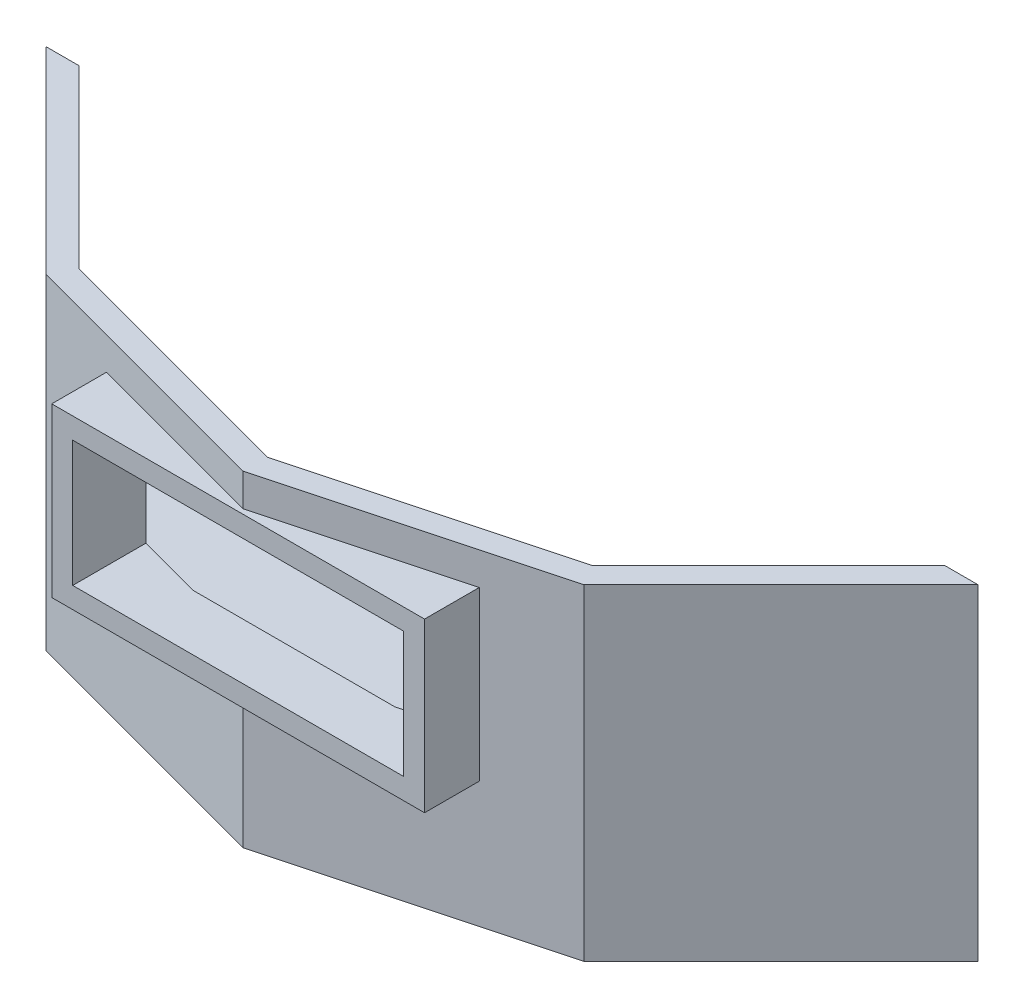
ISO-10303-21;
HEADER;
FILE_DESCRIPTION(('STEP AP214'),'2;1');
FILE_NAME('part.step','',(''),(''),'','','');
FILE_SCHEMA(('AUTOMOTIVE_DESIGN { 1 0 10303 214 1 1 1 1 }'));
ENDSEC;
DATA;
#1=APPLICATION_CONTEXT('core data for automotive mechanical design processes');
#2=APPLICATION_PROTOCOL_DEFINITION('international standard','automotive_design',2000,#1);
#3=PRODUCT_CONTEXT('',#1,'mechanical');
#4=PRODUCT('Part','Part','',(#3));
#5=PRODUCT_RELATED_PRODUCT_CATEGORY('part','',(#4));
#6=PRODUCT_DEFINITION_FORMATION('','',#4);
#7=PRODUCT_DEFINITION_CONTEXT('part definition',#1,'design');
#8=PRODUCT_DEFINITION('design','',#6,#7);
#9=PRODUCT_DEFINITION_SHAPE('','',#8);
#10=(LENGTH_UNIT() NAMED_UNIT(*) SI_UNIT(.MILLI.,.METRE.));
#11=(NAMED_UNIT(*) PLANE_ANGLE_UNIT() SI_UNIT($,.RADIAN.));
#12=(NAMED_UNIT(*) SI_UNIT($,.STERADIAN.) SOLID_ANGLE_UNIT());
#13=UNCERTAINTY_MEASURE_WITH_UNIT(LENGTH_MEASURE(1.E-05),#10,'distance_accuracy_value','');
#14=(GEOMETRIC_REPRESENTATION_CONTEXT(3) GLOBAL_UNCERTAINTY_ASSIGNED_CONTEXT((#13)) GLOBAL_UNIT_ASSIGNED_CONTEXT((#10,
#11,#12)) REPRESENTATION_CONTEXT('',''));
#15=CARTESIAN_POINT('',(0.,0.,0.));
#16=DIRECTION('',(0.,0.,1.));
#17=DIRECTION('',(1.,0.,0.));
#18=AXIS2_PLACEMENT_3D('',#15,#16,#17);
#19=CARTESIAN_POINT('',(0.,0.,104.5));
#20=DIRECTION('',(0.,0.,1.));
#21=DIRECTION('',(1.,0.,0.));
#22=AXIS2_PLACEMENT_3D('',#19,#20,#21);
#23=PLANE('',#22);
#24=DIRECTION('',(0.,-1.,0.));
#25=VECTOR('',#24,1.);
#26=CARTESIAN_POINT('',(21.6222817591213,5.,104.5));
#27=LINE('',#26,#25);
#28=CARTESIAN_POINT('',(21.6222817591213,63.,104.5));
#29=VERTEX_POINT('',#28);
#30=CARTESIAN_POINT('',(21.6222817591213,58.5,104.5));
#31=VERTEX_POINT('',#30);
#32=EDGE_CURVE('E277',#29,#31,#27,.T.);
#33=ORIENTED_EDGE('',*,*,#32,.T.);
#34=DIRECTION('',(-1.,0.,0.));
#35=VECTOR('',#34,1.);
#36=CARTESIAN_POINT('',(0.,58.5,104.5));
#37=LINE('',#36,#35);
#38=CARTESIAN_POINT('',(-21.6222817591212,58.5,104.5));
#39=VERTEX_POINT('',#38);
#40=EDGE_CURVE('E237',#31,#39,#37,.T.);
#41=ORIENTED_EDGE('',*,*,#40,.T.);
#42=DIRECTION('',(0.,1.,0.));
#43=VECTOR('',#42,1.);
#44=CARTESIAN_POINT('',(-21.6222817591212,5.,104.5));
#45=LINE('',#44,#43);
#46=CARTESIAN_POINT('',(-21.6222817591212,63.,104.5));
#47=VERTEX_POINT('',#46);
#48=EDGE_CURVE('E375',#39,#47,#45,.T.);
#49=ORIENTED_EDGE('',*,*,#48,.T.);
#50=DIRECTION('',(-1.,0.,0.));
#51=VECTOR('',#50,1.);
#52=CARTESIAN_POINT('',(-40.,63.,104.5));
#53=LINE('',#52,#51);
#54=EDGE_CURVE('E254',#29,#47,#53,.T.);
#55=ORIENTED_EDGE('',*,*,#54,.F.);
#56=EDGE_LOOP('',(#33,#41,#49,#55));
#57=FACE_BOUND('',#56,.T.);
#58=ADVANCED_FACE('F39',(#57),#23,.F.);
#59=CARTESIAN_POINT('',(-57.7350269189626,70.,100.));
#60=DIRECTION('',(0.258819045102521,0.,-0.965925826289068));
#61=DIRECTION('',(-0.965925826289068,0.,-0.258819045102521));
#62=AXIS2_PLACEMENT_3D('',#59,#60,#61);
#63=PLANE('',#62);
#64=DIRECTION('',(0.965925826289068,0.,0.258819045102521));
#65=VECTOR('',#64,1.);
#66=CARTESIAN_POINT('',(-57.7350269189626,27.,100.));
#67=LINE('',#66,#65);
#68=CARTESIAN_POINT('',(-40.,27.,104.75208614068));
#69=VERTEX_POINT('',#68);
#70=CARTESIAN_POINT('',(0.,27.,115.470053837925));
#71=VERTEX_POINT('',#70);
#72=EDGE_CURVE('E295',#69,#71,#67,.T.);
#73=ORIENTED_EDGE('',*,*,#72,.F.);
#74=DIRECTION('',(0.,-1.,0.));
#75=VECTOR('',#74,1.);
#76=CARTESIAN_POINT('',(-40.,70.,104.75208614068));
#77=LINE('',#76,#75);
#78=CARTESIAN_POINT('',(-40.,63.,104.75208614068));
#79=VERTEX_POINT('',#78);
#80=EDGE_CURVE('E11',#79,#69,#77,.T.);
#81=ORIENTED_EDGE('',*,*,#80,.F.);
#82=DIRECTION('',(-0.965925826289068,0.,-0.258819045102521));
#83=VECTOR('',#82,1.);
#84=CARTESIAN_POINT('',(-57.7350269189626,63.,100.));
#85=LINE('',#84,#83);
#86=CARTESIAN_POINT('',(0.,63.,115.470053837925));
#87=VERTEX_POINT('',#86);
#88=EDGE_CURVE('E286',#87,#79,#85,.T.);
#89=ORIENTED_EDGE('',*,*,#88,.F.);
#90=DIRECTION('',(0.,-1.,0.));
#91=VECTOR('',#90,1.);
#92=CARTESIAN_POINT('',(0.,70.,115.470053837925));
#93=LINE('',#92,#91);
#94=CARTESIAN_POINT('',(0.,70.,115.470053837925));
#95=VERTEX_POINT('',#94);
#96=EDGE_CURVE('E363',#95,#87,#93,.T.);
#97=ORIENTED_EDGE('',*,*,#96,.F.);
#98=DIRECTION('',(0.965925826289068,0.,0.258819045102521));
#99=VECTOR('',#98,1.);
#100=CARTESIAN_POINT('',(-57.7350269189626,70.,100.));
#101=LINE('',#100,#99);
#102=CARTESIAN_POINT('',(-57.7350269189626,70.,100.));
#103=VERTEX_POINT('',#102);
#104=EDGE_CURVE('E339',#103,#95,#101,.T.);
#105=ORIENTED_EDGE('',*,*,#104,.F.);
#106=DIRECTION('',(0.,-1.,0.));
#107=VECTOR('',#106,1.);
#108=CARTESIAN_POINT('',(-57.7350269189626,70.,100.));
#109=LINE('',#108,#107);
#110=CARTESIAN_POINT('',(-57.7350269189626,0.,100.));
#111=VERTEX_POINT('',#110);
#112=EDGE_CURVE('E365',#103,#111,#109,.T.);
#113=ORIENTED_EDGE('',*,*,#112,.T.);
#114=DIRECTION('',(0.965925826289068,0.,0.258819045102521));
#115=VECTOR('',#114,1.);
#116=CARTESIAN_POINT('',(-57.7350269189626,0.,100.));
#117=LINE('',#116,#115);
#118=CARTESIAN_POINT('',(0.,0.,115.470053837925));
#119=VERTEX_POINT('',#118);
#120=EDGE_CURVE('E350',#111,#119,#117,.T.);
#121=ORIENTED_EDGE('',*,*,#120,.T.);
#122=EDGE_CURVE('E362',#71,#119,#93,.T.);
#123=ORIENTED_EDGE('',*,*,#122,.F.);
#124=EDGE_LOOP('',(#73,#81,#89,#97,#105,#113,#121,#123));
#125=FACE_BOUND('',#124,.T.);
#126=ADVANCED_FACE('F402',(#125),#63,.F.);
#127=CARTESIAN_POINT('',(0.,70.,115.470053837925));
#128=DIRECTION('',(-0.258819045102521,0.,-0.965925826289068));
#129=DIRECTION('',(-0.965925826289068,0.,0.258819045102521));
#130=AXIS2_PLACEMENT_3D('',#127,#128,#129);
#131=PLANE('',#130);
#132=DIRECTION('',(0.965925826289068,0.,-0.258819045102521));
#133=VECTOR('',#132,1.);
#134=CARTESIAN_POINT('',(0.,27.,115.470053837925));
#135=LINE('',#134,#133);
#136=CARTESIAN_POINT('',(40.,27.,104.75208614068));
#137=VERTEX_POINT('',#136);
#138=EDGE_CURVE('E292',#71,#137,#135,.T.);
#139=ORIENTED_EDGE('',*,*,#138,.F.);
#140=ORIENTED_EDGE('',*,*,#122,.T.);
#141=DIRECTION('',(0.965925826289068,0.,-0.258819045102521));
#142=VECTOR('',#141,1.);
#143=CARTESIAN_POINT('',(0.,0.,115.470053837925));
#144=LINE('',#143,#142);
#145=CARTESIAN_POINT('',(57.7350269189626,0.,100.));
#146=VERTEX_POINT('',#145);
#147=EDGE_CURVE('E353',#119,#146,#144,.T.);
#148=ORIENTED_EDGE('',*,*,#147,.T.);
#149=DIRECTION('',(0.,-1.,0.));
#150=VECTOR('',#149,1.);
#151=CARTESIAN_POINT('',(57.7350269189626,70.,100.));
#152=LINE('',#151,#150);
#153=CARTESIAN_POINT('',(57.7350269189626,70.,100.));
#154=VERTEX_POINT('',#153);
#155=EDGE_CURVE('E359',#154,#146,#152,.T.);
#156=ORIENTED_EDGE('',*,*,#155,.F.);
#157=DIRECTION('',(0.965925826289068,0.,-0.258819045102521));
#158=VECTOR('',#157,1.);
#159=CARTESIAN_POINT('',(0.,70.,115.470053837925));
#160=LINE('',#159,#158);
#161=EDGE_CURVE('E341',#95,#154,#160,.T.);
#162=ORIENTED_EDGE('',*,*,#161,.F.);
#163=ORIENTED_EDGE('',*,*,#96,.T.);
#164=DIRECTION('',(-0.965925826289068,0.,0.258819045102521));
#165=VECTOR('',#164,1.);
#166=CARTESIAN_POINT('',(0.,63.,115.470053837925));
#167=LINE('',#166,#165);
#168=CARTESIAN_POINT('',(40.,63.,104.75208614068));
#169=VERTEX_POINT('',#168);
#170=EDGE_CURVE('E283',#169,#87,#167,.T.);
#171=ORIENTED_EDGE('',*,*,#170,.F.);
#172=DIRECTION('',(0.,1.,0.));
#173=VECTOR('',#172,1.);
#174=CARTESIAN_POINT('',(40.,70.,104.75208614068));
#175=LINE('',#174,#173);
#176=EDGE_CURVE('E47',#137,#169,#175,.T.);
#177=ORIENTED_EDGE('',*,*,#176,.F.);
#178=EDGE_LOOP('',(#139,#140,#148,#156,#162,#163,#171,#177));
#179=FACE_BOUND('',#178,.T.);
#180=ADVANCED_FACE('F400',(#179),#131,.F.);
#181=CARTESIAN_POINT('',(0.,5.,110.293672935875));
#182=DIRECTION('',(0.258819045102521,0.,0.965925826289068));
#183=DIRECTION('',(0.965925826289068,0.,-0.258819045102521));
#184=AXIS2_PLACEMENT_3D('',#181,#182,#183);
#185=PLANE('',#184);
#186=DIRECTION('',(0.,1.,0.));
#187=VECTOR('',#186,1.);
#188=CARTESIAN_POINT('',(35.5,5.00000000000001,100.78147660457));
#189=LINE('',#188,#187);
#190=CARTESIAN_POINT('',(35.5,31.5,100.78147660457));
#191=VERTEX_POINT('',#190);
#192=CARTESIAN_POINT('',(35.5,58.5,100.78147660457));
#193=VERTEX_POINT('',#192);
#194=EDGE_CURVE('E209',#191,#193,#189,.T.);
#195=ORIENTED_EDGE('',*,*,#194,.T.);
#196=DIRECTION('',(-0.965925826289068,0.,0.258819045102521));
#197=VECTOR('',#196,1.);
#198=CARTESIAN_POINT('',(0.,58.5,110.293672935875));
#199=LINE('',#198,#197);
#200=EDGE_CURVE('E243',#193,#31,#199,.T.);
#201=ORIENTED_EDGE('',*,*,#200,.T.);
#202=ORIENTED_EDGE('',*,*,#32,.F.);
#203=DIRECTION('',(0.965925826289068,0.,-0.258819045102521));
#204=VECTOR('',#203,1.);
#205=CARTESIAN_POINT('',(0.,63.,110.293672935875));
#206=LINE('',#205,#204);
#207=CARTESIAN_POINT('',(0.,63.,110.293672935875));
#208=VERTEX_POINT('',#207);
#209=EDGE_CURVE('E280',#208,#29,#206,.T.);
#210=ORIENTED_EDGE('',*,*,#209,.F.);
#211=DIRECTION('',(0.,1.,0.));
#212=VECTOR('',#211,1.);
#213=CARTESIAN_POINT('',(0.,5.,110.293672935875));
#214=LINE('',#213,#212);
#215=CARTESIAN_POINT('',(0.,70.,110.293672935875));
#216=VERTEX_POINT('',#215);
#217=EDGE_CURVE('E324',#208,#216,#214,.T.);
#218=ORIENTED_EDGE('',*,*,#217,.T.);
#219=DIRECTION('',(0.965925826289068,0.,-0.258819045102521));
#220=VECTOR('',#219,1.);
#221=CARTESIAN_POINT('',(0.,70.,110.293672935875));
#222=LINE('',#221,#220);
#223=CARTESIAN_POINT('',(55.1468364679374,70.,95.5171226391597));
#224=VERTEX_POINT('',#223);
#225=EDGE_CURVE('E314',#216,#224,#222,.T.);
#226=ORIENTED_EDGE('',*,*,#225,.T.);
#227=DIRECTION('',(0.,1.,0.));
#228=VECTOR('',#227,1.);
#229=CARTESIAN_POINT('',(55.1468364679374,5.,95.5171226391597));
#230=LINE('',#229,#228);
#231=CARTESIAN_POINT('',(55.1468364679374,5.,95.5171226391597));
#232=VERTEX_POINT('',#231);
#233=EDGE_CURVE('E318',#232,#224,#230,.T.);
#234=ORIENTED_EDGE('',*,*,#233,.F.);
#235=DIRECTION('',(0.965925826289068,0.,-0.258819045102521));
#236=VECTOR('',#235,1.);
#237=CARTESIAN_POINT('',(0.,5.,110.293672935875));
#238=LINE('',#237,#236);
#239=CARTESIAN_POINT('',(0.,5.,110.293672935875));
#240=VERTEX_POINT('',#239);
#241=EDGE_CURVE('E305',#240,#232,#238,.T.);
#242=ORIENTED_EDGE('',*,*,#241,.F.);
#243=CARTESIAN_POINT('',(0.,27.,110.293672935875));
#244=VERTEX_POINT('',#243);
#245=EDGE_CURVE('E321',#240,#244,#214,.T.);
#246=ORIENTED_EDGE('',*,*,#245,.T.);
#247=DIRECTION('',(-0.965925826289068,0.,0.258819045102521));
#248=VECTOR('',#247,1.);
#249=CARTESIAN_POINT('',(0.,27.,110.293672935875));
#250=LINE('',#249,#248);
#251=CARTESIAN_POINT('',(21.6222817591213,27.,104.5));
#252=VERTEX_POINT('',#251);
#253=EDGE_CURVE('E289',#252,#244,#250,.T.);
#254=ORIENTED_EDGE('',*,*,#253,.F.);
#255=CARTESIAN_POINT('',(21.6222817591213,31.5,104.5));
#256=VERTEX_POINT('',#255);
#257=EDGE_CURVE('E276',#256,#252,#27,.T.);
#258=ORIENTED_EDGE('',*,*,#257,.F.);
#259=DIRECTION('',(0.965925826289068,0.,-0.258819045102521));
#260=VECTOR('',#259,1.);
#261=CARTESIAN_POINT('',(0.,31.5,110.293672935875));
#262=LINE('',#261,#260);
#263=EDGE_CURVE('E54',#256,#191,#262,.T.);
#264=ORIENTED_EDGE('',*,*,#263,.T.);
#265=EDGE_LOOP('',(#195,#201,#202,#210,#218,#226,#234,#242,#246,#254,#258,#264));
#266=FACE_BOUND('',#265,.T.);
#267=ADVANCED_FACE('F465',(#266),#185,.F.);
#268=CARTESIAN_POINT('',(-55.1468364679374,5.,95.5171226391597));
#269=DIRECTION('',(-0.258819045102521,0.,0.965925826289068));
#270=DIRECTION('',(0.965925826289068,0.,0.258819045102521));
#271=AXIS2_PLACEMENT_3D('',#268,#269,#270);
#272=PLANE('',#271);
#273=ORIENTED_EDGE('',*,*,#48,.F.);
#274=DIRECTION('',(-0.965925826289068,0.,-0.258819045102521));
#275=VECTOR('',#274,1.);
#276=CARTESIAN_POINT('',(-55.1468364679374,58.5,95.5171226391597));
#277=LINE('',#276,#275);
#278=CARTESIAN_POINT('',(-35.5,58.5,100.78147660457));
#279=VERTEX_POINT('',#278);
#280=EDGE_CURVE('E240',#39,#279,#277,.T.);
#281=ORIENTED_EDGE('',*,*,#280,.T.);
#282=DIRECTION('',(0.,-1.,0.));
#283=VECTOR('',#282,1.);
#284=CARTESIAN_POINT('',(-35.5,5.00000000000001,100.78147660457));
#285=LINE('',#284,#283);
#286=CARTESIAN_POINT('',(-35.5,31.5,100.78147660457));
#287=VERTEX_POINT('',#286);
#288=EDGE_CURVE('E246',#279,#287,#285,.T.);
#289=ORIENTED_EDGE('',*,*,#288,.T.);
#290=DIRECTION('',(0.965925826289068,0.,0.258819045102521));
#291=VECTOR('',#290,1.);
#292=CARTESIAN_POINT('',(-55.1468364679374,31.5,95.5171226391597));
#293=LINE('',#292,#291);
#294=CARTESIAN_POINT('',(-21.6222817591212,31.5,104.5));
#295=VERTEX_POINT('',#294);
#296=EDGE_CURVE('E232',#287,#295,#293,.T.);
#297=ORIENTED_EDGE('',*,*,#296,.T.);
#298=CARTESIAN_POINT('',(-21.6222817591212,27.,104.5));
#299=VERTEX_POINT('',#298);
#300=EDGE_CURVE('E376',#299,#295,#45,.T.);
#301=ORIENTED_EDGE('',*,*,#300,.F.);
#302=DIRECTION('',(-0.965925826289068,0.,-0.258819045102521));
#303=VECTOR('',#302,1.);
#304=CARTESIAN_POINT('',(-55.1468364679374,27.,95.5171226391597));
#305=LINE('',#304,#303);
#306=EDGE_CURVE('E382',#244,#299,#305,.T.);
#307=ORIENTED_EDGE('',*,*,#306,.F.);
#308=ORIENTED_EDGE('',*,*,#245,.F.);
#309=DIRECTION('',(0.965925826289068,0.,0.258819045102521));
#310=VECTOR('',#309,1.);
#311=CARTESIAN_POINT('',(-55.1468364679374,5.,95.5171226391597));
#312=LINE('',#311,#310);
#313=CARTESIAN_POINT('',(-55.1468364679374,5.,95.5171226391597));
#314=VERTEX_POINT('',#313);
#315=EDGE_CURVE('E301',#314,#240,#312,.T.);
#316=ORIENTED_EDGE('',*,*,#315,.F.);
#317=DIRECTION('',(0.,1.,0.));
#318=VECTOR('',#317,1.);
#319=CARTESIAN_POINT('',(-55.1468364679374,5.,95.5171226391597));
#320=LINE('',#319,#318);
#321=CARTESIAN_POINT('',(-55.1468364679374,70.,95.5171226391597));
#322=VERTEX_POINT('',#321);
#323=EDGE_CURVE('E311',#314,#322,#320,.T.);
#324=ORIENTED_EDGE('',*,*,#323,.T.);
#325=DIRECTION('',(0.965925826289068,0.,0.258819045102521));
#326=VECTOR('',#325,1.);
#327=CARTESIAN_POINT('',(-55.1468364679374,70.,95.5171226391597));
#328=LINE('',#327,#326);
#329=EDGE_CURVE('E298',#322,#216,#328,.T.);
#330=ORIENTED_EDGE('',*,*,#329,.T.);
#331=ORIENTED_EDGE('',*,*,#217,.F.);
#332=DIRECTION('',(0.965925826289068,0.,0.258819045102521));
#333=VECTOR('',#332,1.);
#334=CARTESIAN_POINT('',(-55.1468364679374,63.,95.5171226391597));
#335=LINE('',#334,#333);
#336=EDGE_CURVE('E379',#47,#208,#335,.T.);
#337=ORIENTED_EDGE('',*,*,#336,.F.);
#338=EDGE_LOOP('',(#273,#281,#289,#297,#301,#307,#308,#316,#324,#330,#331,#337));
#339=FACE_BOUND('',#338,.T.);
#340=ADVANCED_FACE('F462',(#339),#272,.F.);
#341=CARTESIAN_POINT('',(-100.,70.,57.7350269189626));
#342=DIRECTION('',(0.,0.,1.));
#343=DIRECTION('',(1.,0.,0.));
#344=AXIS2_PLACEMENT_3D('',#341,#342,#343);
#345=PLANE('',#344);
#346=DIRECTION('',(-1.,0.,0.));
#347=VECTOR('',#346,1.);
#348=CARTESIAN_POINT('',(-100.,5.,57.7350269189626));
#349=LINE('',#348,#347);
#350=CARTESIAN_POINT('',(92.9289321881345,5.,57.7350269189626));
#351=VERTEX_POINT('',#350);
#352=CARTESIAN_POINT('',(-92.9289321881346,5.,57.7350269189626));
#353=VERTEX_POINT('',#352);
#354=EDGE_CURVE('E373',#351,#353,#349,.T.);
#355=ORIENTED_EDGE('',*,*,#354,.F.);
#356=DIRECTION('',(0.,1.,0.));
#357=VECTOR('',#356,1.);
#358=CARTESIAN_POINT('',(92.9289321881345,70.,57.7350269189626));
#359=LINE('',#358,#357);
#360=CARTESIAN_POINT('',(92.9289321881345,70.,57.7350269189626));
#361=VERTEX_POINT('',#360);
#362=EDGE_CURVE('E329',#351,#361,#359,.T.);
#363=ORIENTED_EDGE('',*,*,#362,.T.);
#364=DIRECTION('',(-1.,0.,0.));
#365=VECTOR('',#364,1.);
#366=CARTESIAN_POINT('',(-100.,70.,57.7350269189626));
#367=LINE('',#366,#365);
#368=CARTESIAN_POINT('',(100.,70.,57.7350269189626));
#369=VERTEX_POINT('',#368);
#370=EDGE_CURVE('E333',#369,#361,#367,.T.);
#371=ORIENTED_EDGE('',*,*,#370,.F.);
#372=DIRECTION('',(0.,-1.,0.));
#373=VECTOR('',#372,1.);
#374=CARTESIAN_POINT('',(100.,70.,57.7350269189626));
#375=LINE('',#374,#373);
#376=CARTESIAN_POINT('',(100.,0.,57.7350269189626));
#377=VERTEX_POINT('',#376);
#378=EDGE_CURVE('E345',#369,#377,#375,.T.);
#379=ORIENTED_EDGE('',*,*,#378,.T.);
#380=DIRECTION('',(-1.,0.,0.));
#381=VECTOR('',#380,1.);
#382=CARTESIAN_POINT('',(-100.,0.,57.7350269189626));
#383=LINE('',#382,#381);
#384=CARTESIAN_POINT('',(-100.,0.,57.7350269189626));
#385=VERTEX_POINT('',#384);
#386=EDGE_CURVE('E332',#377,#385,#383,.T.);
#387=ORIENTED_EDGE('',*,*,#386,.T.);
#388=DIRECTION('',(0.,-1.,0.));
#389=VECTOR('',#388,1.);
#390=CARTESIAN_POINT('',(-100.,70.,57.7350269189626));
#391=LINE('',#390,#389);
#392=CARTESIAN_POINT('',(-100.,70.,57.7350269189626));
#393=VERTEX_POINT('',#392);
#394=EDGE_CURVE('E368',#393,#385,#391,.T.);
#395=ORIENTED_EDGE('',*,*,#394,.F.);
#396=CARTESIAN_POINT('',(-92.9289321881346,70.,57.7350269189626));
#397=VERTEX_POINT('',#396);
#398=EDGE_CURVE('E337',#397,#393,#367,.T.);
#399=ORIENTED_EDGE('',*,*,#398,.F.);
#400=DIRECTION('',(0.,-1.,0.));
#401=VECTOR('',#400,1.);
#402=CARTESIAN_POINT('',(-92.9289321881346,70.,57.7350269189626));
#403=LINE('',#402,#401);
#404=EDGE_CURVE('E320',#397,#353,#403,.T.);
#405=ORIENTED_EDGE('',*,*,#404,.T.);
#406=EDGE_LOOP('',(#355,#363,#371,#379,#387,#395,#399,#405));
#407=FACE_BOUND('',#406,.T.);
#408=ADVANCED_FACE('F41',(#407),#345,.F.);
#409=CARTESIAN_POINT('',(-100.,70.,57.7350269189626));
#410=DIRECTION('',(0.707106781186548,0.,-0.707106781186547));
#411=DIRECTION('',(-0.707106781186547,0.,-0.707106781186548));
#412=AXIS2_PLACEMENT_3D('',#409,#410,#411);
#413=PLANE('',#412);
#414=DIRECTION('',(0.707106781186547,0.,0.707106781186548));
#415=VECTOR('',#414,1.);
#416=CARTESIAN_POINT('',(-100.,0.,57.7350269189626));
#417=LINE('',#416,#415);
#418=EDGE_CURVE('E348',#385,#111,#417,.T.);
#419=ORIENTED_EDGE('',*,*,#418,.T.);
#420=ORIENTED_EDGE('',*,*,#112,.F.);
#421=DIRECTION('',(0.707106781186547,0.,0.707106781186548));
#422=VECTOR('',#421,1.);
#423=CARTESIAN_POINT('',(-100.,70.,57.7350269189626));
#424=LINE('',#423,#422);
#425=EDGE_CURVE('E336',#393,#103,#424,.T.);
#426=ORIENTED_EDGE('',*,*,#425,.F.);
#427=ORIENTED_EDGE('',*,*,#394,.T.);
#428=EDGE_LOOP('',(#419,#420,#426,#427));
#429=FACE_BOUND('',#428,.T.);
#430=ADVANCED_FACE('F482',(#429),#413,.F.);
#431=CARTESIAN_POINT('',(57.7350269189626,70.,100.));
#432=DIRECTION('',(-0.707106781186548,0.,-0.707106781186548));
#433=DIRECTION('',(-0.707106781186547,0.,0.707106781186548));
#434=AXIS2_PLACEMENT_3D('',#431,#432,#433);
#435=PLANE('',#434);
#436=DIRECTION('',(0.707106781186547,0.,-0.707106781186548));
#437=VECTOR('',#436,1.);
#438=CARTESIAN_POINT('',(57.7350269189626,0.,100.));
#439=LINE('',#438,#437);
#440=EDGE_CURVE('E355',#146,#377,#439,.T.);
#441=ORIENTED_EDGE('',*,*,#440,.T.);
#442=ORIENTED_EDGE('',*,*,#378,.F.);
#443=DIRECTION('',(0.707106781186547,0.,-0.707106781186548));
#444=VECTOR('',#443,1.);
#445=CARTESIAN_POINT('',(57.7350269189626,70.,100.));
#446=LINE('',#445,#444);
#447=EDGE_CURVE('E343',#154,#369,#446,.T.);
#448=ORIENTED_EDGE('',*,*,#447,.F.);
#449=ORIENTED_EDGE('',*,*,#155,.T.);
#450=EDGE_LOOP('',(#441,#442,#448,#449));
#451=FACE_BOUND('',#450,.T.);
#452=ADVANCED_FACE('F415',(#451),#435,.F.);
#453=CARTESIAN_POINT('',(0.,70.,0.));
#454=DIRECTION('',(0.,1.,0.));
#455=DIRECTION('',(0.,0.,1.));
#456=AXIS2_PLACEMENT_3D('',#453,#454,#455);
#457=PLANE('',#456);
#458=DIRECTION('',(0.707106781186547,0.,-0.707106781186548));
#459=VECTOR('',#458,1.);
#460=CARTESIAN_POINT('',(55.1468364679374,70.,95.5171226391597));
#461=LINE('',#460,#459);
#462=EDGE_CURVE('E302',#224,#361,#461,.T.);
#463=ORIENTED_EDGE('',*,*,#462,.F.);
#464=ORIENTED_EDGE('',*,*,#225,.F.);
#465=ORIENTED_EDGE('',*,*,#329,.F.);
#466=DIRECTION('',(0.707106781186548,0.,0.707106781186547));
#467=VECTOR('',#466,1.);
#468=CARTESIAN_POINT('',(-75.3319795535485,70.,75.3319795535486));
#469=LINE('',#468,#467);
#470=EDGE_CURVE('E371',#397,#322,#469,.T.);
#471=ORIENTED_EDGE('',*,*,#470,.F.);
#472=ORIENTED_EDGE('',*,*,#398,.T.);
#473=ORIENTED_EDGE('',*,*,#425,.T.);
#474=ORIENTED_EDGE('',*,*,#104,.T.);
#475=ORIENTED_EDGE('',*,*,#161,.T.);
#476=ORIENTED_EDGE('',*,*,#447,.T.);
#477=ORIENTED_EDGE('',*,*,#370,.T.);
#478=EDGE_LOOP('',(#463,#464,#465,#471,#472,#473,#474,#475,#476,#477));
#479=FACE_BOUND('',#478,.T.);
#480=ADVANCED_FACE('F420',(#479),#457,.T.);
#481=CARTESIAN_POINT('',(0.,0.,0.));
#482=DIRECTION('',(0.,1.,0.));
#483=DIRECTION('',(0.,0.,1.));
#484=AXIS2_PLACEMENT_3D('',#481,#482,#483);
#485=PLANE('',#484);
#486=ORIENTED_EDGE('',*,*,#386,.F.);
#487=ORIENTED_EDGE('',*,*,#440,.F.);
#488=ORIENTED_EDGE('',*,*,#147,.F.);
#489=ORIENTED_EDGE('',*,*,#120,.F.);
#490=ORIENTED_EDGE('',*,*,#418,.F.);
#491=EDGE_LOOP('',(#486,#487,#488,#489,#490));
#492=FACE_BOUND('',#491,.T.);
#493=ADVANCED_FACE('F410',(#492),#485,.F.);
#494=CARTESIAN_POINT('',(0.,5.,0.));
#495=DIRECTION('',(0.,1.,0.));
#496=DIRECTION('',(0.,0.,1.));
#497=AXIS2_PLACEMENT_3D('',#494,#495,#496);
#498=PLANE('',#497);
#499=ORIENTED_EDGE('',*,*,#354,.T.);
#500=DIRECTION('',(0.707106781186548,0.,0.707106781186547));
#501=VECTOR('',#500,1.);
#502=CARTESIAN_POINT('',(-95.5171226391598,5.,55.1468364679374));
#503=LINE('',#502,#501);
#504=EDGE_CURVE('E299',#353,#314,#503,.T.);
#505=ORIENTED_EDGE('',*,*,#504,.T.);
#506=ORIENTED_EDGE('',*,*,#315,.T.);
#507=ORIENTED_EDGE('',*,*,#241,.T.);
#508=DIRECTION('',(0.707106781186547,0.,-0.707106781186548));
#509=VECTOR('',#508,1.);
#510=CARTESIAN_POINT('',(55.1468364679374,5.,95.5171226391597));
#511=LINE('',#510,#509);
#512=EDGE_CURVE('E308',#232,#351,#511,.T.);
#513=ORIENTED_EDGE('',*,*,#512,.T.);
#514=EDGE_LOOP('',(#499,#505,#506,#507,#513));
#515=FACE_BOUND('',#514,.T.);
#516=ADVANCED_FACE('F471',(#515),#498,.T.);
#517=CARTESIAN_POINT('',(55.1468364679374,5.,95.5171226391597));
#518=DIRECTION('',(0.707106781186548,0.,0.707106781186547));
#519=DIRECTION('',(0.707106781186547,0.,-0.707106781186548));
#520=AXIS2_PLACEMENT_3D('',#517,#518,#519);
#521=PLANE('',#520);
#522=ORIENTED_EDGE('',*,*,#512,.F.);
#523=ORIENTED_EDGE('',*,*,#233,.T.);
#524=ORIENTED_EDGE('',*,*,#462,.T.);
#525=ORIENTED_EDGE('',*,*,#362,.F.);
#526=EDGE_LOOP('',(#522,#523,#524,#525));
#527=FACE_BOUND('',#526,.T.);
#528=ADVANCED_FACE('F455',(#527),#521,.F.);
#529=CARTESIAN_POINT('',(-95.5171226391598,5.,55.1468364679374));
#530=DIRECTION('',(-0.707106781186547,0.,0.707106781186548));
#531=DIRECTION('',(0.707106781186548,0.,0.707106781186547));
#532=AXIS2_PLACEMENT_3D('',#529,#530,#531);
#533=PLANE('',#532);
#534=ORIENTED_EDGE('',*,*,#470,.T.);
#535=ORIENTED_EDGE('',*,*,#323,.F.);
#536=ORIENTED_EDGE('',*,*,#504,.F.);
#537=ORIENTED_EDGE('',*,*,#404,.F.);
#538=EDGE_LOOP('',(#534,#535,#536,#537));
#539=FACE_BOUND('',#538,.T.);
#540=ADVANCED_FACE('F448',(#539),#533,.F.);
#541=ORIENTED_EDGE('',*,*,#300,.T.);
#542=DIRECTION('',(1.,0.,0.));
#543=VECTOR('',#542,1.);
#544=CARTESIAN_POINT('',(0.,31.5,104.5));
#545=LINE('',#544,#543);
#546=EDGE_CURVE('E228',#295,#256,#545,.T.);
#547=ORIENTED_EDGE('',*,*,#546,.T.);
#548=ORIENTED_EDGE('',*,*,#257,.T.);
#549=DIRECTION('',(1.,0.,0.));
#550=VECTOR('',#549,1.);
#551=CARTESIAN_POINT('',(-40.,27.,104.5));
#552=LINE('',#551,#550);
#553=EDGE_CURVE('E249',#299,#252,#552,.T.);
#554=ORIENTED_EDGE('',*,*,#553,.F.);
#555=EDGE_LOOP('',(#541,#547,#548,#554));
#556=FACE_BOUND('',#555,.T.);
#557=ADVANCED_FACE('F440',(#556),#23,.F.);
#558=CARTESIAN_POINT('',(-40.,63.,116.5));
#559=DIRECTION('',(0.,-1.,0.));
#560=DIRECTION('',(0.,0.,-1.));
#561=AXIS2_PLACEMENT_3D('',#558,#559,#560);
#562=PLANE('',#561);
#563=ORIENTED_EDGE('',*,*,#336,.T.);
#564=ORIENTED_EDGE('',*,*,#209,.T.);
#565=ORIENTED_EDGE('',*,*,#54,.T.);
#566=EDGE_LOOP('',(#563,#564,#565));
#567=FACE_BOUND('',#566,.T.);
#568=ADVANCED_FACE('F433',(#567),#562,.F.);
#569=CARTESIAN_POINT('',(-40.,27.,116.5));
#570=DIRECTION('',(0.,1.,0.));
#571=DIRECTION('',(0.,0.,1.));
#572=AXIS2_PLACEMENT_3D('',#569,#570,#571);
#573=PLANE('',#572);
#574=ORIENTED_EDGE('',*,*,#553,.T.);
#575=ORIENTED_EDGE('',*,*,#253,.T.);
#576=ORIENTED_EDGE('',*,*,#306,.T.);
#577=EDGE_LOOP('',(#574,#575,#576));
#578=FACE_BOUND('',#577,.T.);
#579=ADVANCED_FACE('F426',(#578),#573,.F.);
#580=CARTESIAN_POINT('',(-40.,63.,116.5));
#581=DIRECTION('',(1.,0.,0.));
#582=DIRECTION('',(0.,1.,0.));
#583=AXIS2_PLACEMENT_3D('',#580,#581,#582);
#584=PLANE('',#583);
#585=DIRECTION('',(0.,0.,-1.));
#586=VECTOR('',#585,1.);
#587=CARTESIAN_POINT('',(-40.,63.,116.5));
#588=LINE('',#587,#586);
#589=CARTESIAN_POINT('',(-40.,63.,116.5));
#590=VERTEX_POINT('',#589);
#591=EDGE_CURVE('E260',#590,#79,#588,.T.);
#592=ORIENTED_EDGE('',*,*,#591,.T.);
#593=ORIENTED_EDGE('',*,*,#80,.T.);
#594=DIRECTION('',(0.,0.,-1.));
#595=VECTOR('',#594,1.);
#596=CARTESIAN_POINT('',(-40.,27.,116.5));
#597=LINE('',#596,#595);
#598=CARTESIAN_POINT('',(-40.,27.,116.5));
#599=VERTEX_POINT('',#598);
#600=EDGE_CURVE('E273',#599,#69,#597,.T.);
#601=ORIENTED_EDGE('',*,*,#600,.F.);
#602=DIRECTION('',(0.,-1.,0.));
#603=VECTOR('',#602,1.);
#604=CARTESIAN_POINT('',(-40.,63.,116.5));
#605=LINE('',#604,#603);
#606=EDGE_CURVE('E250',#590,#599,#605,.T.);
#607=ORIENTED_EDGE('',*,*,#606,.F.);
#608=EDGE_LOOP('',(#592,#593,#601,#607));
#609=FACE_BOUND('',#608,.T.);
#610=ADVANCED_FACE('F424',(#609),#584,.F.);
#611=CARTESIAN_POINT('',(40.,63.,116.5));
#612=DIRECTION('',(-1.,0.,0.));
#613=DIRECTION('',(0.,-1.,0.));
#614=AXIS2_PLACEMENT_3D('',#611,#612,#613);
#615=PLANE('',#614);
#616=DIRECTION('',(0.,0.,-1.));
#617=VECTOR('',#616,1.);
#618=CARTESIAN_POINT('',(40.,27.,116.5));
#619=LINE('',#618,#617);
#620=CARTESIAN_POINT('',(40.,27.,116.5));
#621=VERTEX_POINT('',#620);
#622=EDGE_CURVE('E270',#621,#137,#619,.T.);
#623=ORIENTED_EDGE('',*,*,#622,.T.);
#624=ORIENTED_EDGE('',*,*,#176,.T.);
#625=DIRECTION('',(0.,0.,-1.));
#626=VECTOR('',#625,1.);
#627=CARTESIAN_POINT('',(40.,63.,116.5));
#628=LINE('',#627,#626);
#629=CARTESIAN_POINT('',(40.,63.,116.5));
#630=VERTEX_POINT('',#629);
#631=EDGE_CURVE('E267',#630,#169,#628,.T.);
#632=ORIENTED_EDGE('',*,*,#631,.F.);
#633=DIRECTION('',(0.,1.,0.));
#634=VECTOR('',#633,1.);
#635=CARTESIAN_POINT('',(40.,63.,116.5));
#636=LINE('',#635,#634);
#637=EDGE_CURVE('E256',#621,#630,#636,.T.);
#638=ORIENTED_EDGE('',*,*,#637,.F.);
#639=EDGE_LOOP('',(#623,#624,#632,#638));
#640=FACE_BOUND('',#639,.T.);
#641=ADVANCED_FACE('F387',(#640),#615,.F.);
#642=ORIENTED_EDGE('',*,*,#600,.T.);
#643=ORIENTED_EDGE('',*,*,#72,.T.);
#644=ORIENTED_EDGE('',*,*,#138,.T.);
#645=ORIENTED_EDGE('',*,*,#622,.F.);
#646=DIRECTION('',(1.,0.,0.));
#647=VECTOR('',#646,1.);
#648=CARTESIAN_POINT('',(-40.,27.,116.5));
#649=LINE('',#648,#647);
#650=EDGE_CURVE('E253',#599,#621,#649,.T.);
#651=ORIENTED_EDGE('',*,*,#650,.F.);
#652=EDGE_LOOP('',(#642,#643,#644,#645,#651));
#653=FACE_BOUND('',#652,.T.);
#654=ADVANCED_FACE('F398',(#653),#573,.F.);
#655=ORIENTED_EDGE('',*,*,#170,.T.);
#656=ORIENTED_EDGE('',*,*,#88,.T.);
#657=ORIENTED_EDGE('',*,*,#591,.F.);
#658=DIRECTION('',(-1.,0.,0.));
#659=VECTOR('',#658,1.);
#660=CARTESIAN_POINT('',(-40.,63.,116.5));
#661=LINE('',#660,#659);
#662=EDGE_CURVE('E258',#630,#590,#661,.T.);
#663=ORIENTED_EDGE('',*,*,#662,.F.);
#664=ORIENTED_EDGE('',*,*,#631,.T.);
#665=EDGE_LOOP('',(#655,#656,#657,#663,#664));
#666=FACE_BOUND('',#665,.T.);
#667=ADVANCED_FACE('F393',(#666),#562,.F.);
#668=CARTESIAN_POINT('',(0.,0.,116.5));
#669=DIRECTION('',(0.,0.,1.));
#670=DIRECTION('',(1.,0.,0.));
#671=AXIS2_PLACEMENT_3D('',#668,#669,#670);
#672=PLANE('',#671);
#673=DIRECTION('',(0.,-1.,0.));
#674=VECTOR('',#673,1.);
#675=CARTESIAN_POINT('',(-35.5,58.5,116.5));
#676=LINE('',#675,#674);
#677=CARTESIAN_POINT('',(-35.5,58.5,116.5));
#678=VERTEX_POINT('',#677);
#679=CARTESIAN_POINT('',(-35.5,31.5,116.5));
#680=VERTEX_POINT('',#679);
#681=EDGE_CURVE('E62',#678,#680,#676,.T.);
#682=ORIENTED_EDGE('',*,*,#681,.F.);
#683=DIRECTION('',(-1.,0.,0.));
#684=VECTOR('',#683,1.);
#685=CARTESIAN_POINT('',(-35.5,58.5,116.5));
#686=LINE('',#685,#684);
#687=CARTESIAN_POINT('',(35.5,58.5,116.5));
#688=VERTEX_POINT('',#687);
#689=EDGE_CURVE('E221',#688,#678,#686,.T.);
#690=ORIENTED_EDGE('',*,*,#689,.F.);
#691=DIRECTION('',(0.,1.,0.));
#692=VECTOR('',#691,1.);
#693=CARTESIAN_POINT('',(35.5,58.5,116.5));
#694=LINE('',#693,#692);
#695=CARTESIAN_POINT('',(35.5,31.5,116.5));
#696=VERTEX_POINT('',#695);
#697=EDGE_CURVE('E206',#696,#688,#694,.T.);
#698=ORIENTED_EDGE('',*,*,#697,.F.);
#699=DIRECTION('',(1.,0.,0.));
#700=VECTOR('',#699,1.);
#701=CARTESIAN_POINT('',(-35.5,31.5,116.5));
#702=LINE('',#701,#700);
#703=EDGE_CURVE('E214',#680,#696,#702,.T.);
#704=ORIENTED_EDGE('',*,*,#703,.F.);
#705=EDGE_LOOP('',(#682,#690,#698,#704));
#706=FACE_BOUND('',#705,.T.);
#707=ORIENTED_EDGE('',*,*,#606,.T.);
#708=ORIENTED_EDGE('',*,*,#650,.T.);
#709=ORIENTED_EDGE('',*,*,#637,.T.);
#710=ORIENTED_EDGE('',*,*,#662,.T.);
#711=EDGE_LOOP('',(#707,#708,#709,#710));
#712=FACE_BOUND('',#711,.T.);
#713=ADVANCED_FACE('F218',(#706,#712),#672,.T.);
#714=CARTESIAN_POINT('',(-35.5,58.5,96.5));
#715=DIRECTION('',(-1.,0.,0.));
#716=DIRECTION('',(0.,-1.,0.));
#717=AXIS2_PLACEMENT_3D('',#714,#715,#716);
#718=PLANE('',#717);
#719=DIRECTION('',(0.,0.,1.));
#720=VECTOR('',#719,1.);
#721=CARTESIAN_POINT('',(-35.5,58.5,96.5));
#722=LINE('',#721,#720);
#723=EDGE_CURVE('E226',#279,#678,#722,.T.);
#724=ORIENTED_EDGE('',*,*,#723,.T.);
#725=ORIENTED_EDGE('',*,*,#681,.T.);
#726=DIRECTION('',(0.,0.,1.));
#727=VECTOR('',#726,1.);
#728=CARTESIAN_POINT('',(-35.5,31.5,96.5));
#729=LINE('',#728,#727);
#730=EDGE_CURVE('E211',#287,#680,#729,.T.);
#731=ORIENTED_EDGE('',*,*,#730,.F.);
#732=ORIENTED_EDGE('',*,*,#288,.F.);
#733=EDGE_LOOP('',(#724,#725,#731,#732));
#734=FACE_BOUND('',#733,.T.);
#735=ADVANCED_FACE('F603',(#734),#718,.F.);
#736=CARTESIAN_POINT('',(-35.5,58.5,96.5));
#737=DIRECTION('',(0.,1.,0.));
#738=DIRECTION('',(0.,0.,1.));
#739=AXIS2_PLACEMENT_3D('',#736,#737,#738);
#740=PLANE('',#739);
#741=DIRECTION('',(0.,0.,1.));
#742=VECTOR('',#741,1.);
#743=CARTESIAN_POINT('',(35.5,58.5,96.5));
#744=LINE('',#743,#742);
#745=EDGE_CURVE('E210',#193,#688,#744,.T.);
#746=ORIENTED_EDGE('',*,*,#745,.T.);
#747=ORIENTED_EDGE('',*,*,#689,.T.);
#748=ORIENTED_EDGE('',*,*,#723,.F.);
#749=ORIENTED_EDGE('',*,*,#280,.F.);
#750=ORIENTED_EDGE('',*,*,#40,.F.);
#751=ORIENTED_EDGE('',*,*,#200,.F.);
#752=EDGE_LOOP('',(#746,#747,#748,#749,#750,#751));
#753=FACE_BOUND('',#752,.T.);
#754=ADVANCED_FACE('F611',(#753),#740,.F.);
#755=CARTESIAN_POINT('',(35.5,58.5,96.5));
#756=DIRECTION('',(1.,0.,0.));
#757=DIRECTION('',(0.,1.,0.));
#758=AXIS2_PLACEMENT_3D('',#755,#756,#757);
#759=PLANE('',#758);
#760=DIRECTION('',(0.,0.,1.));
#761=VECTOR('',#760,1.);
#762=CARTESIAN_POINT('',(35.5,31.5,96.5));
#763=LINE('',#762,#761);
#764=EDGE_CURVE('E201',#191,#696,#763,.T.);
#765=ORIENTED_EDGE('',*,*,#764,.T.);
#766=ORIENTED_EDGE('',*,*,#697,.T.);
#767=ORIENTED_EDGE('',*,*,#745,.F.);
#768=ORIENTED_EDGE('',*,*,#194,.F.);
#769=EDGE_LOOP('',(#765,#766,#767,#768));
#770=FACE_BOUND('',#769,.T.);
#771=ADVANCED_FACE('F203',(#770),#759,.F.);
#772=CARTESIAN_POINT('',(-35.5,31.5,96.5));
#773=DIRECTION('',(0.,-1.,0.));
#774=DIRECTION('',(0.,0.,-1.));
#775=AXIS2_PLACEMENT_3D('',#772,#773,#774);
#776=PLANE('',#775);
#777=ORIENTED_EDGE('',*,*,#546,.F.);
#778=ORIENTED_EDGE('',*,*,#296,.F.);
#779=ORIENTED_EDGE('',*,*,#730,.T.);
#780=ORIENTED_EDGE('',*,*,#703,.T.);
#781=ORIENTED_EDGE('',*,*,#764,.F.);
#782=ORIENTED_EDGE('',*,*,#263,.F.);
#783=EDGE_LOOP('',(#777,#778,#779,#780,#781,#782));
#784=FACE_BOUND('',#783,.T.);
#785=ADVANCED_FACE('F215',(#784),#776,.F.);
#786=CLOSED_SHELL('',(#58,#126,#180,#267,#340,#408,#430,#452,#480,#493,#516,#528,#540,#557,#568,
#579,#610,#641,#654,#667,#713,#735,#754,#771,#785));
#787=MANIFOLD_SOLID_BREP('B2',#786);
#788=ADVANCED_BREP_SHAPE_REPRESENTATION('',(#18,#787),#14);
#789=SHAPE_DEFINITION_REPRESENTATION(#9,#788);
ENDSEC;
END-ISO-10303-21;
